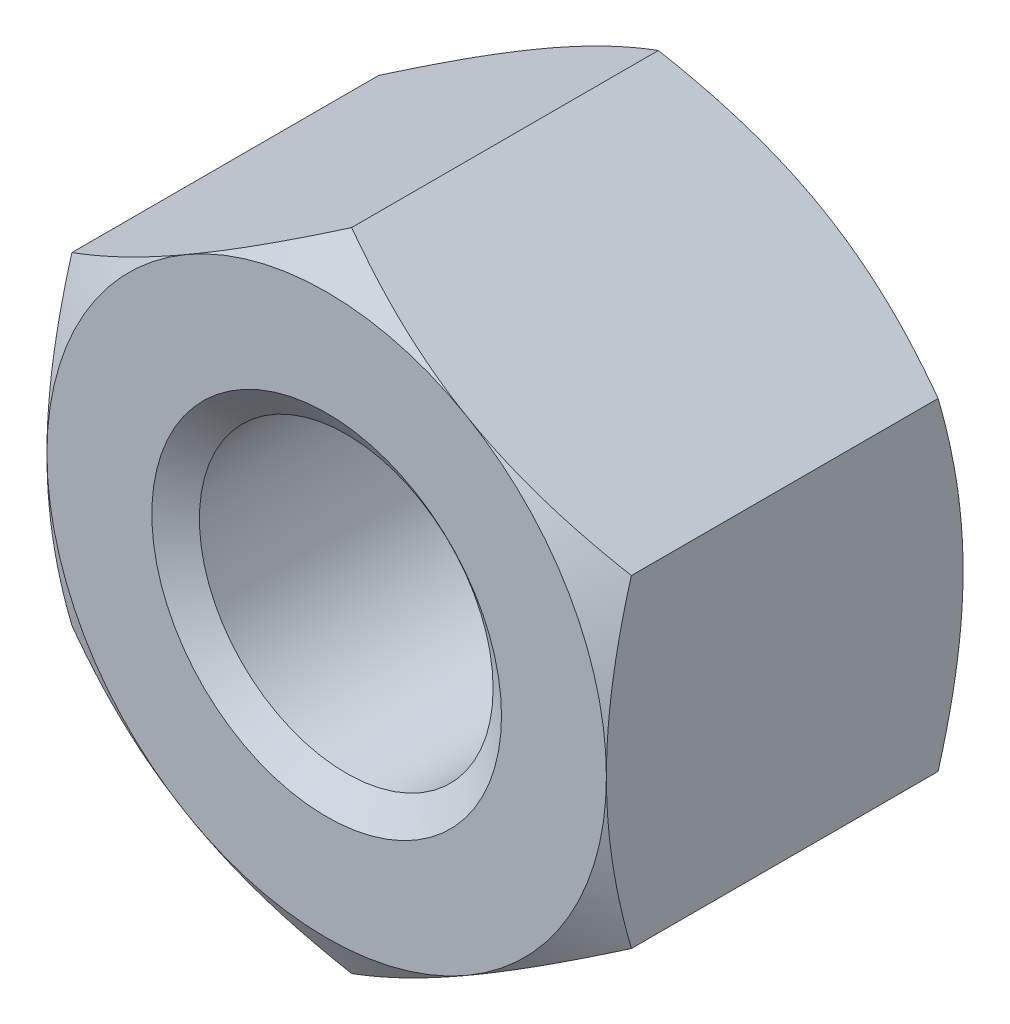
ISO-10303-21;
HEADER;
FILE_DESCRIPTION(('STEP AP214'),'2;1');
FILE_NAME('part.step','',(''),(''),'','','');
FILE_SCHEMA(('AUTOMOTIVE_DESIGN { 1 0 10303 214 1 1 1 1 }'));
ENDSEC;
DATA;
#1=APPLICATION_CONTEXT('core data for automotive mechanical design processes');
#2=APPLICATION_PROTOCOL_DEFINITION('international standard','automotive_design',2000,#1);
#3=PRODUCT_CONTEXT('',#1,'mechanical');
#4=PRODUCT('Part','Part','',(#3));
#5=PRODUCT_RELATED_PRODUCT_CATEGORY('part','',(#4));
#6=PRODUCT_DEFINITION_FORMATION('','',#4);
#7=PRODUCT_DEFINITION_CONTEXT('part definition',#1,'design');
#8=PRODUCT_DEFINITION('design','',#6,#7);
#9=PRODUCT_DEFINITION_SHAPE('','',#8);
#10=(LENGTH_UNIT() NAMED_UNIT(*) SI_UNIT(.MILLI.,.METRE.));
#11=(NAMED_UNIT(*) PLANE_ANGLE_UNIT() SI_UNIT($,.RADIAN.));
#12=(NAMED_UNIT(*) SI_UNIT($,.STERADIAN.) SOLID_ANGLE_UNIT());
#13=UNCERTAINTY_MEASURE_WITH_UNIT(LENGTH_MEASURE(1.E-05),#10,'distance_accuracy_value','');
#14=(GEOMETRIC_REPRESENTATION_CONTEXT(3) GLOBAL_UNCERTAINTY_ASSIGNED_CONTEXT((#13)) GLOBAL_UNIT_ASSIGNED_CONTEXT((#10,
#11,#12)) REPRESENTATION_CONTEXT('',''));
#15=CARTESIAN_POINT('',(0.,0.,0.));
#16=DIRECTION('',(0.,0.,1.));
#17=DIRECTION('',(1.,0.,0.));
#18=AXIS2_PLACEMENT_3D('',#15,#16,#17);
#19=CARTESIAN_POINT('',(0.,0.,-5.1));
#20=DIRECTION('',(0.,0.,1.));
#21=DIRECTION('',(1.,0.,0.));
#22=AXIS2_PLACEMENT_3D('',#19,#20,#21);
#23=CYLINDRICAL_SURFACE('',#22,2.1);
#24=CARTESIAN_POINT('',(0.,0.,-0.28008301528388));
#25=DIRECTION('',(0.,0.,1.));
#26=DIRECTION('',(1.,0.,0.));
#27=AXIS2_PLACEMENT_3D('',#24,#25,#26);
#28=CIRCLE('',#27,2.1);
#29=CARTESIAN_POINT('',(2.1,0.,-0.28008301528388));
#30=VERTEX_POINT('',#29);
#31=EDGE_CURVE('E175',#30,#30,#28,.F.);
#32=ORIENTED_EDGE('',*,*,#31,.F.);
#33=EDGE_LOOP('',(#32));
#34=FACE_BOUND('',#33,.T.);
#35=CARTESIAN_POINT('',(0.,0.,-4.79451698471611));
#36=DIRECTION('',(0.,0.,-1.));
#37=DIRECTION('',(-1.,0.,0.));
#38=AXIS2_PLACEMENT_3D('',#35,#36,#37);
#39=CIRCLE('',#38,2.1);
#40=CARTESIAN_POINT('',(-2.1,0.,-4.79451698471611));
#41=VERTEX_POINT('',#40);
#42=EDGE_CURVE('E40',#41,#41,#39,.F.);
#43=ORIENTED_EDGE('',*,*,#42,.F.);
#44=EDGE_LOOP('',(#43));
#45=FACE_BOUND('',#44,.T.);
#46=ADVANCED_FACE('F35',(#34,#45),#23,.F.);
#47=CARTESIAN_POINT('',(0.,4.61880215351702,-5.1));
#48=DIRECTION('',(0.,0.,-1.));
#49=DIRECTION('',(-1.,0.,0.));
#50=AXIS2_PLACEMENT_3D('',#47,#48,#49);
#51=PLANE('',#50);
#52=CARTESIAN_POINT('',(0.,0.,-5.1));
#53=DIRECTION('',(0.,0.,-1.));
#54=DIRECTION('',(-1.,0.,0.));
#55=AXIS2_PLACEMENT_3D('',#52,#53,#54);
#56=CIRCLE('',#55,4.);
#57=CARTESIAN_POINT('',(-4.,0.,-5.1));
#58=VERTEX_POINT('',#57);
#59=CARTESIAN_POINT('',(-2.00000000000002,-3.46410161513774,-5.1));
#60=VERTEX_POINT('',#59);
#61=EDGE_CURVE('E171',#58,#60,#56,.F.);
#62=ORIENTED_EDGE('',*,*,#61,.F.);
#63=CARTESIAN_POINT('',(-2.00000000000001,3.46410161513775,-5.1));
#64=VERTEX_POINT('',#63);
#65=EDGE_CURVE('E153',#64,#58,#56,.F.);
#66=ORIENTED_EDGE('',*,*,#65,.F.);
#67=CARTESIAN_POINT('',(2.00000000000003,3.46410161513774,-5.1));
#68=VERTEX_POINT('',#67);
#69=EDGE_CURVE('E170',#68,#64,#56,.F.);
#70=ORIENTED_EDGE('',*,*,#69,.F.);
#71=CARTESIAN_POINT('',(0.,0.,-5.1));
#72=DIRECTION('',(0.,0.,1.));
#73=DIRECTION('',(1.,0.,0.));
#74=AXIS2_PLACEMENT_3D('',#71,#72,#73);
#75=CIRCLE('',#74,4.);
#76=CARTESIAN_POINT('',(4.,0.,-5.1));
#77=VERTEX_POINT('',#76);
#78=EDGE_CURVE('E245',#77,#68,#75,.T.);
#79=ORIENTED_EDGE('',*,*,#78,.F.);
#80=CARTESIAN_POINT('',(2.00000000000001,-3.46410161513775,-5.1));
#81=VERTEX_POINT('',#80);
#82=EDGE_CURVE('E361',#81,#77,#56,.F.);
#83=ORIENTED_EDGE('',*,*,#82,.F.);
#84=EDGE_CURVE('E365',#60,#81,#56,.F.);
#85=ORIENTED_EDGE('',*,*,#84,.F.);
#86=EDGE_LOOP('',(#62,#66,#70,#79,#83,#85));
#87=FACE_BOUND('',#86,.T.);
#88=CARTESIAN_POINT('',(0.,0.,-5.1));
#89=DIRECTION('',(0.,0.,-1.));
#90=DIRECTION('',(-1.,0.,0.));
#91=AXIS2_PLACEMENT_3D('',#88,#89,#90);
#92=CIRCLE('',#91,2.5);
#93=CARTESIAN_POINT('',(-2.5,0.,-5.1));
#94=VERTEX_POINT('',#93);
#95=EDGE_CURVE('E178',#94,#94,#92,.F.);
#96=ORIENTED_EDGE('',*,*,#95,.T.);
#97=EDGE_LOOP('',(#96));
#98=FACE_BOUND('',#97,.T.);
#99=ADVANCED_FACE('F298',(#87,#98),#51,.T.);
#100=CARTESIAN_POINT('',(0.,4.61880215351702,0.));
#101=DIRECTION('',(0.,0.,-1.));
#102=DIRECTION('',(-1.,0.,0.));
#103=AXIS2_PLACEMENT_3D('',#100,#101,#102);
#104=PLANE('',#103);
#105=CARTESIAN_POINT('',(0.,0.,0.));
#106=DIRECTION('',(0.,0.,-1.));
#107=DIRECTION('',(-1.,0.,0.));
#108=AXIS2_PLACEMENT_3D('',#105,#106,#107);
#109=CIRCLE('',#108,4.);
#110=CARTESIAN_POINT('',(-4.,0.,0.));
#111=VERTEX_POINT('',#110);
#112=CARTESIAN_POINT('',(-2.00000000000001,3.46410161513775,0.));
#113=VERTEX_POINT('',#112);
#114=EDGE_CURVE('E11',#111,#113,#109,.T.);
#115=ORIENTED_EDGE('',*,*,#114,.F.);
#116=CARTESIAN_POINT('',(-2.00000000000002,-3.46410161513774,0.));
#117=VERTEX_POINT('',#116);
#118=EDGE_CURVE('E47',#117,#111,#109,.T.);
#119=ORIENTED_EDGE('',*,*,#118,.F.);
#120=CARTESIAN_POINT('',(2.00000000000001,-3.46410161513775,0.));
#121=VERTEX_POINT('',#120);
#122=EDGE_CURVE('E174',#121,#117,#109,.T.);
#123=ORIENTED_EDGE('',*,*,#122,.F.);
#124=CARTESIAN_POINT('',(4.,0.,0.));
#125=VERTEX_POINT('',#124);
#126=EDGE_CURVE('E352',#125,#121,#109,.T.);
#127=ORIENTED_EDGE('',*,*,#126,.F.);
#128=CARTESIAN_POINT('',(0.,0.,0.));
#129=DIRECTION('',(0.,0.,1.));
#130=DIRECTION('',(1.,0.,0.));
#131=AXIS2_PLACEMENT_3D('',#128,#129,#130);
#132=CIRCLE('',#131,4.);
#133=CARTESIAN_POINT('',(2.00000000000003,3.46410161513774,0.));
#134=VERTEX_POINT('',#133);
#135=EDGE_CURVE('E129',#125,#134,#132,.T.);
#136=ORIENTED_EDGE('',*,*,#135,.T.);
#137=EDGE_CURVE('E45',#113,#134,#109,.T.);
#138=ORIENTED_EDGE('',*,*,#137,.F.);
#139=EDGE_LOOP('',(#115,#119,#123,#127,#136,#138));
#140=FACE_BOUND('',#139,.T.);
#141=CARTESIAN_POINT('',(0.,0.,0.));
#142=DIRECTION('',(0.,0.,1.));
#143=DIRECTION('',(1.,0.,0.));
#144=AXIS2_PLACEMENT_3D('',#141,#142,#143);
#145=CIRCLE('',#144,2.5);
#146=CARTESIAN_POINT('',(2.5,0.,0.));
#147=VERTEX_POINT('',#146);
#148=EDGE_CURVE('E177',#147,#147,#145,.T.);
#149=ORIENTED_EDGE('',*,*,#148,.F.);
#150=EDGE_LOOP('',(#149));
#151=FACE_BOUND('',#150,.T.);
#152=ADVANCED_FACE('F250',(#140,#151),#104,.F.);
#153=CARTESIAN_POINT('',(0.,4.61880215351702,-5.1));
#154=DIRECTION('',(-0.500000000000002,0.866025403784437,0.));
#155=DIRECTION('',(-0.866025403784437,-0.500000000000002,0.));
#156=AXIS2_PLACEMENT_3D('',#153,#154,#155);
#157=PLANE('',#156);
#158=DIRECTION('',(0.,0.,1.));
#159=VECTOR('',#158,1.);
#160=CARTESIAN_POINT('',(-4.,2.3094010767585,-5.1));
#161=LINE('',#160,#159);
#162=CARTESIAN_POINT('',(-4.,2.30940107675853,-4.74273441009183));
#163=VERTEX_POINT('',#162);
#164=CARTESIAN_POINT('',(-4.,2.3094010767585,-0.357265589908162));
#165=VERTEX_POINT('',#164);
#166=EDGE_CURVE('E165',#163,#165,#161,.T.);
#167=ORIENTED_EDGE('',*,*,#166,.T.);
#168=CARTESIAN_POINT('',(-4.0002,2.30928560670466,-0.357332259074766));
#169=CARTESIAN_POINT('',(-3.82442084967677,2.4107717464617,-0.298717873648281));
#170=CARTESIAN_POINT('',(-3.64712438367362,2.51313390883499,-0.245410321462261));
#171=CARTESIAN_POINT('',(-3.28946140682429,2.71963072479811,-0.152361670746402));
#172=CARTESIAN_POINT('',(-3.10908854102985,2.82376904741904,-0.112653489029702));
#173=CARTESIAN_POINT('',(-2.75057818129721,3.03075510011795,-0.0508422152802773));
#174=CARTESIAN_POINT('',(-2.57249584706486,3.13357098372491,-0.028327731522887));
#175=CARTESIAN_POINT('',(-2.21549328283349,3.33968651028528,-0.00145062314658006));
#176=CARTESIAN_POINT('',(-2.0365743503559,3.44298540411434,0.00293425857305829));
#177=CARTESIAN_POINT('',(-1.70225715780327,3.63600352522932,-0.00619007293996944));
#178=CARTESIAN_POINT('',(-1.54680884001293,3.72575165335065,-0.017458953987994));
#179=CARTESIAN_POINT('',(-1.23692494436494,3.90466320392055,-0.0531739907981941));
#180=CARTESIAN_POINT('',(-1.08249043825587,3.99382600759479,-0.0776323457115346));
#181=CARTESIAN_POINT('',(-0.771967672225416,4.17310641015198,-0.138776064919293));
#182=CARTESIAN_POINT('',(-0.615918711936891,4.26320131938132,-0.175720603654868));
#183=CARTESIAN_POINT('',(-0.306148164596151,4.44204742827552,-0.259570072548033));
#184=CARTESIAN_POINT('',(-0.15242260922621,4.53080091904968,-0.306455302212748));
#185=CARTESIAN_POINT('',(0.000200000000011592,4.61891762357086,-0.357332259074776));
#186=B_SPLINE_CURVE_WITH_KNOTS('',3,(#168,#169,#170,#171,#172,#173,#174,#175,#176,#177,#178,
#179,#180,#181,#182,#183,#184,#185),.UNSPECIFIED.,.F.,.F.,(4,2,2,2,2,2,2,2,4),(0.,
0.634047835695967,1.26961969224543,1.88946157213122,2.50854226669297,3.04757825393386,
3.58711366126904,4.13861653143765,4.68903648037745),.UNSPECIFIED.);
#187=EDGE_CURVE('E134',#165,#113,#186,.T.);
#188=ORIENTED_EDGE('',*,*,#187,.T.);
#189=CARTESIAN_POINT('',(0.,4.61880215351702,-0.357265589908172));
#190=VERTEX_POINT('',#189);
#191=EDGE_CURVE('E54',#113,#190,#186,.T.);
#192=ORIENTED_EDGE('',*,*,#191,.T.);
#193=DIRECTION('',(0.,0.,1.));
#194=VECTOR('',#193,1.);
#195=CARTESIAN_POINT('',(0.,4.61880215351702,-5.1));
#196=LINE('',#195,#194);
#197=CARTESIAN_POINT('',(0.,4.61880215351702,-4.74273441009183));
#198=VERTEX_POINT('',#197);
#199=EDGE_CURVE('E150',#198,#190,#196,.T.);
#200=ORIENTED_EDGE('',*,*,#199,.F.);
#201=CARTESIAN_POINT('',(-4.0002,2.30928560670466,-4.74266774092523));
#202=CARTESIAN_POINT('',(-3.82442084967677,2.4107717464617,-4.80128212635172));
#203=CARTESIAN_POINT('',(-3.64712438367362,2.51313390883499,-4.85458967853774));
#204=CARTESIAN_POINT('',(-3.28946140682429,2.71963072479811,-4.9476383292536));
#205=CARTESIAN_POINT('',(-3.10908854102985,2.82376904741904,-4.9873465109703));
#206=CARTESIAN_POINT('',(-2.75057818129721,3.03075510011795,-5.04915778471972));
#207=CARTESIAN_POINT('',(-2.57249584706486,3.13357098372491,-5.07167226847711));
#208=CARTESIAN_POINT('',(-2.21549328283349,3.33968651028528,-5.09854937685342));
#209=CARTESIAN_POINT('',(-2.0365743503559,3.44298540411434,-5.10293425857306));
#210=CARTESIAN_POINT('',(-1.70225715780327,3.63600352522932,-5.09380992706003));
#211=CARTESIAN_POINT('',(-1.54680884001293,3.72575165335065,-5.082541046012));
#212=CARTESIAN_POINT('',(-1.23692494436494,3.90466320392055,-5.0468260092018));
#213=CARTESIAN_POINT('',(-1.08249043825587,3.99382600759479,-5.02236765428846));
#214=CARTESIAN_POINT('',(-0.771967672225416,4.17310641015198,-4.96122393508071));
#215=CARTESIAN_POINT('',(-0.61591871193689,4.26320131938132,-4.92427939634513));
#216=CARTESIAN_POINT('',(-0.306148164596151,4.44204742827552,-4.84042992745197));
#217=CARTESIAN_POINT('',(-0.15242260922621,4.53080091904968,-4.79354469778725));
#218=CARTESIAN_POINT('',(0.000200000000011907,4.61891762357086,-4.74266774092522));
#219=B_SPLINE_CURVE_WITH_KNOTS('',3,(#201,#202,#203,#204,#205,#206,#207,#208,#209,#210,#211,
#212,#213,#214,#215,#216,#217,#218),.UNSPECIFIED.,.F.,.F.,(4,2,2,2,2,2,2,2,4),(0.,
0.634047835695967,1.26961969224544,1.88946157213122,2.50854226669297,3.04757825393386,
3.58711366126904,4.13861653143765,4.68903648037745),.UNSPECIFIED.);
#220=EDGE_CURVE('E168',#64,#198,#219,.T.);
#221=ORIENTED_EDGE('',*,*,#220,.F.);
#222=EDGE_CURVE('E260',#163,#64,#219,.T.);
#223=ORIENTED_EDGE('',*,*,#222,.F.);
#224=EDGE_LOOP('',(#167,#188,#192,#200,#221,#223));
#225=FACE_BOUND('',#224,.T.);
#226=ADVANCED_FACE('F37',(#225),#157,.T.);
#227=CARTESIAN_POINT('',(4.,2.30940107675848,-5.1));
#228=DIRECTION('',(0.500000000000007,0.866025403784435,0.));
#229=DIRECTION('',(-0.866025403784435,0.500000000000007,0.));
#230=AXIS2_PLACEMENT_3D('',#227,#228,#229);
#231=PLANE('',#230);
#232=ORIENTED_EDGE('',*,*,#199,.T.);
#233=CARTESIAN_POINT('',(-0.000199999999988659,4.61891762357086,-0.357332259074776));
#234=CARTESIAN_POINT('',(0.175579150323239,4.51743148381382,-0.298717873648291));
#235=CARTESIAN_POINT('',(0.352875616326392,4.41506932144053,-0.24541032146227));
#236=CARTESIAN_POINT('',(0.710538593175717,4.2085725054774,-0.152361670746408));
#237=CARTESIAN_POINT('',(0.890911458970162,4.10443418285647,-0.112653489029708));
#238=CARTESIAN_POINT('',(1.2494218187028,3.89744813015756,-0.050842215280281));
#239=CARTESIAN_POINT('',(1.42750415293515,3.79463224655059,-0.02832773152289));
#240=CARTESIAN_POINT('',(1.78450671716652,3.58851671999022,-0.00145062314658152));
#241=CARTESIAN_POINT('',(1.96342564964411,3.48521782616116,0.00293425857305787));
#242=CARTESIAN_POINT('',(2.29774284219674,3.29219970504618,-0.00619007293996798));
#243=CARTESIAN_POINT('',(2.45319115998707,3.20245157692485,-0.0174589539879915));
#244=CARTESIAN_POINT('',(2.76307505563506,3.02354002635495,-0.0531739907981898));
#245=CARTESIAN_POINT('',(2.91750956174414,2.93437722268071,-0.0776323457115296));
#246=CARTESIAN_POINT('',(3.22803232777458,2.75509682012352,-0.138776064919286));
#247=CARTESIAN_POINT('',(3.38408128806311,2.66500191089418,-0.175720603654859));
#248=CARTESIAN_POINT('',(3.69385183540384,2.48615580199999,-0.259570072548023));
#249=CARTESIAN_POINT('',(3.84757739077378,2.39740231122583,-0.306455302212736));
#250=CARTESIAN_POINT('',(4.0002,2.30928560670464,-0.357332259074763));
#251=B_SPLINE_CURVE_WITH_KNOTS('',3,(#233,#234,#235,#236,#237,#238,#239,#240,#241,#242,#243,
#244,#245,#246,#247,#248,#249,#250),.UNSPECIFIED.,.F.,.F.,(4,2,2,2,2,2,2,2,4),(0.,
0.634047835695969,1.26961969224544,1.88946157213123,2.50854226669298,3.04757825393387,
3.58711366126905,4.13861653143765,4.68903648037745),.UNSPECIFIED.);
#252=EDGE_CURVE('E144',#190,#134,#251,.T.);
#253=ORIENTED_EDGE('',*,*,#252,.T.);
#254=CARTESIAN_POINT('',(4.,2.30940107675852,-0.357265589908172));
#255=VERTEX_POINT('',#254);
#256=EDGE_CURVE('E61',#134,#255,#251,.T.);
#257=ORIENTED_EDGE('',*,*,#256,.T.);
#258=DIRECTION('',(0.,0.,1.));
#259=VECTOR('',#258,1.);
#260=CARTESIAN_POINT('',(4.,2.30940107675848,-5.1));
#261=LINE('',#260,#259);
#262=CARTESIAN_POINT('',(4.,2.30940107675852,-4.74273441009183));
#263=VERTEX_POINT('',#262);
#264=EDGE_CURVE('E143',#263,#255,#261,.T.);
#265=ORIENTED_EDGE('',*,*,#264,.F.);
#266=CARTESIAN_POINT('',(-0.00019999999998845,4.61891762357086,-4.74266774092522));
#267=CARTESIAN_POINT('',(0.175579150323239,4.51743148381382,-4.80128212635171));
#268=CARTESIAN_POINT('',(0.352875616326392,4.41506932144053,-4.85458967853773));
#269=CARTESIAN_POINT('',(0.710538593175717,4.2085725054774,-4.94763832925359));
#270=CARTESIAN_POINT('',(0.890911458970162,4.10443418285647,-4.98734651097029));
#271=CARTESIAN_POINT('',(1.2494218187028,3.89744813015756,-5.04915778471972));
#272=CARTESIAN_POINT('',(1.42750415293515,3.79463224655059,-5.07167226847711));
#273=CARTESIAN_POINT('',(1.78450671716652,3.58851671999022,-5.09854937685342));
#274=CARTESIAN_POINT('',(1.96342564964411,3.48521782616116,-5.10293425857306));
#275=CARTESIAN_POINT('',(2.29774284219674,3.29219970504618,-5.09380992706003));
#276=CARTESIAN_POINT('',(2.45319115998708,3.20245157692485,-5.08254104601201));
#277=CARTESIAN_POINT('',(2.76307505563506,3.02354002635495,-5.04682600920181));
#278=CARTESIAN_POINT('',(2.91750956174414,2.93437722268071,-5.02236765428847));
#279=CARTESIAN_POINT('',(3.22803232777459,2.75509682012352,-4.96122393508071));
#280=CARTESIAN_POINT('',(3.38408128806311,2.66500191089418,-4.92427939634514));
#281=CARTESIAN_POINT('',(3.69385183540384,2.48615580199999,-4.84042992745198));
#282=CARTESIAN_POINT('',(3.84757739077378,2.39740231122583,-4.79354469778726));
#283=CARTESIAN_POINT('',(4.0002,2.30928560670464,-4.74266774092524));
#284=B_SPLINE_CURVE_WITH_KNOTS('',3,(#266,#267,#268,#269,#270,#271,#272,#273,#274,#275,#276,
#277,#278,#279,#280,#281,#282,#283),.UNSPECIFIED.,.F.,.F.,(4,2,2,2,2,2,2,2,4),(0.,
0.634047835695968,1.26961969224544,1.88946157213123,2.50854226669298,3.04757825393387,
3.58711366126905,4.13861653143765,4.68903648037745),.UNSPECIFIED.);
#285=EDGE_CURVE('E254',#68,#263,#284,.T.);
#286=ORIENTED_EDGE('',*,*,#285,.F.);
#287=EDGE_CURVE('E259',#198,#68,#284,.T.);
#288=ORIENTED_EDGE('',*,*,#287,.F.);
#289=EDGE_LOOP('',(#232,#253,#257,#265,#286,#288));
#290=FACE_BOUND('',#289,.T.);
#291=ADVANCED_FACE('F141',(#290),#231,.T.);
#292=CARTESIAN_POINT('',(4.,2.30940107675848,-5.1));
#293=DIRECTION('',(-1.,0.,0.));
#294=DIRECTION('',(0.,0.,1.));
#295=AXIS2_PLACEMENT_3D('',#292,#293,#294);
#296=PLANE('',#295);
#297=CARTESIAN_POINT('',(4.,-6.12487198995896,-1.91410682124066));
#298=CARTESIAN_POINT('',(4.,-5.9492493703868,-1.82923627076692));
#299=CARTESIAN_POINT('',(4.,-5.7732115209529,-1.74520940380742));
#300=CARTESIAN_POINT('',(4.,-5.42008084777958,-1.57932514679718));
#301=CARTESIAN_POINT('',(4.,-5.24298784779932,-1.49746813236725));
#302=CARTESIAN_POINT('',(4.,-4.88656571686338,-1.33597446305858));
#303=CARTESIAN_POINT('',(4.,-4.70722958889366,-1.25635319506306));
#304=CARTESIAN_POINT('',(4.,-4.34708334747267,-1.10053058542031));
#305=CARTESIAN_POINT('',(4.,-4.16627331143541,-1.02432906550804));
#306=CARTESIAN_POINT('',(4.,-3.80064706744981,-0.875350650394378));
#307=CARTESIAN_POINT('',(4.,-3.61580892822773,-0.80262728421586));
#308=CARTESIAN_POINT('',(4.,-3.24395246794972,-0.662876230959434));
#309=CARTESIAN_POINT('',(4.,-3.05693390695805,-0.595849177566518));
#310=CARTESIAN_POINT('',(4.,-2.68080318253774,-0.469291748430894));
#311=CARTESIAN_POINT('',(4.,-2.49169643712852,-0.409745434783849));
#312=CARTESIAN_POINT('',(4.,-2.11079454635854,-0.300083356544516));
#313=CARTESIAN_POINT('',(4.,-1.91900027185752,-0.249964609676761));
#314=CARTESIAN_POINT('',(4.,-1.53259232698203,-0.161590794954049));
#315=CARTESIAN_POINT('',(4.,-1.33797792031653,-0.123338885956547));
#316=CARTESIAN_POINT('',(4.,-0.946402725872582,-0.0612742359223484));
#317=CARTESIAN_POINT('',(4.,-0.749441936019801,-0.0374615076517028));
#318=CARTESIAN_POINT('',(4.,-0.355451989627968,-0.0063818131494385));
#319=CARTESIAN_POINT('',(4.,-0.158431311094037,0.000989900761039599));
#320=CARTESIAN_POINT('',(4.,0.235472085607445,-0.0012040663747964));
#321=CARTESIAN_POINT('',(4.,0.432354826312182,-0.010765350815351));
#322=CARTESIAN_POINT('',(4.,0.768560635225495,-0.04087873461359));
#323=CARTESIAN_POINT('',(4.,0.908254618381797,-0.0575092960439085));
#324=CARTESIAN_POINT('',(4.,1.18656349063495,-0.0982134103466896));
#325=CARTESIAN_POINT('',(4.,1.32517820601011,-0.122288137058444));
#326=CARTESIAN_POINT('',(4.,1.73929045452967,-0.204415070950227));
#327=CARTESIAN_POINT('',(4.,2.0128469052872,-0.272348886425148));
#328=CARTESIAN_POINT('',(4.,2.42218253014521,-0.389516359317197));
#329=CARTESIAN_POINT('',(4.,2.56009536361536,-0.43171394181163));
#330=CARTESIAN_POINT('',(4.,2.83448159101401,-0.520284580227755));
#331=CARTESIAN_POINT('',(4.,2.97095590623555,-0.566654756186905));
#332=CARTESIAN_POINT('',(4.,3.24189440516338,-0.662605699180278));
#333=CARTESIAN_POINT('',(4.,3.37636557946835,-0.712166925753491));
#334=CARTESIAN_POINT('',(4.,3.64426461152911,-0.814198353790692));
#335=CARTESIAN_POINT('',(4.,3.77769202239384,-0.866669730963359));
#336=CARTESIAN_POINT('',(4.,3.91063698986681,-0.920309006541782));
#337=B_SPLINE_CURVE_WITH_KNOTS('',3,(#297,#298,#299,#300,#301,#302,#303,#304,#305,#306,#307,
#308,#309,#310,#311,#312,#313,#314,#315,#316,#317,#318,#319,#320,#321,#322,#323,#324,#325,#326,
#327,#328,#329,#330,#331,#332,#333,#334,#335,#336),.UNSPECIFIED.,.F.,.F.,(4,2,2,2,2,2,2,2,2,2,2,
2,2,2,2,2,2,2,2,4),(0.,0.585171792532273,1.17044423059927,1.7590659464599,2.34765694284828,
2.94347400997484,3.5393572721069,4.13394864697602,4.72835161391473,5.32291267067847,
5.91747425310815,6.50823685854039,7.09884609659889,7.52068140825524,7.94258327130842,
8.78701491359832,9.21965281897691,9.65199437116299,10.0819024146297,10.5119854255247),.UNSPECIFIED.);
#338=CARTESIAN_POINT('',(3.99999999999999,-2.30940107675855,-0.357265589908172));
#339=VERTEX_POINT('',#338);
#340=EDGE_CURVE('E136',#339,#125,#337,.T.);
#341=ORIENTED_EDGE('',*,*,#340,.F.);
#342=DIRECTION('',(0.,0.,1.));
#343=VECTOR('',#342,1.);
#344=CARTESIAN_POINT('',(4.,-2.30940107675854,-5.1));
#345=LINE('',#344,#343);
#346=CARTESIAN_POINT('',(3.99999999999999,-2.30940107675855,-4.74273441009183));
#347=VERTEX_POINT('',#346);
#348=EDGE_CURVE('E151',#347,#339,#345,.T.);
#349=ORIENTED_EDGE('',*,*,#348,.F.);
#350=CARTESIAN_POINT('',(4.,-6.12487198995896,-3.18589317875933));
#351=CARTESIAN_POINT('',(4.,-5.9492493703868,-3.27076372923308));
#352=CARTESIAN_POINT('',(4.,-5.7732115209529,-3.35479059619258));
#353=CARTESIAN_POINT('',(4.,-5.42008084777958,-3.52067485320281));
#354=CARTESIAN_POINT('',(4.,-5.24298784779931,-3.60253186763275));
#355=CARTESIAN_POINT('',(4.,-4.88656571686338,-3.76402553694142));
#356=CARTESIAN_POINT('',(4.,-4.70722958889366,-3.84364680493694));
#357=CARTESIAN_POINT('',(4.,-4.34708334747267,-3.99946941457968));
#358=CARTESIAN_POINT('',(4.,-4.16627331143541,-4.07567093449196));
#359=CARTESIAN_POINT('',(4.,-3.80064706744981,-4.22464934960562));
#360=CARTESIAN_POINT('',(4.,-3.61580892822773,-4.29737271578414));
#361=CARTESIAN_POINT('',(4.,-3.24395246794972,-4.43712376904056));
#362=CARTESIAN_POINT('',(4.,-3.05693390695804,-4.50415082243348));
#363=CARTESIAN_POINT('',(4.,-2.68080318253774,-4.6307082515691));
#364=CARTESIAN_POINT('',(4.,-2.49169643712852,-4.69025456521615));
#365=CARTESIAN_POINT('',(4.,-2.11079454635854,-4.79991664345548));
#366=CARTESIAN_POINT('',(4.,-1.91900027185752,-4.85003539032324));
#367=CARTESIAN_POINT('',(4.,-1.53259232698203,-4.93840920504595));
#368=CARTESIAN_POINT('',(4.,-1.33797792031653,-4.97666111404345));
#369=CARTESIAN_POINT('',(4.,-0.946402725872582,-5.03872576407765));
#370=CARTESIAN_POINT('',(4.,-0.749441936019801,-5.0625384923483));
#371=CARTESIAN_POINT('',(4.,-0.355451989627969,-5.09361818685056));
#372=CARTESIAN_POINT('',(4.,-0.158431311094036,-5.10098990076104));
#373=CARTESIAN_POINT('',(4.,0.235472085607445,-5.0987959336252));
#374=CARTESIAN_POINT('',(4.,0.432354826312183,-5.08923464918465));
#375=CARTESIAN_POINT('',(4.,0.768560635225495,-5.05912126538641));
#376=CARTESIAN_POINT('',(4.,0.908254618381797,-5.04249070395609));
#377=CARTESIAN_POINT('',(4.,1.18656349063495,-5.00178658965331));
#378=CARTESIAN_POINT('',(4.,1.32517820601011,-4.97771186294156));
#379=CARTESIAN_POINT('',(4.,1.73929045452967,-4.89558492904977));
#380=CARTESIAN_POINT('',(4.,2.01284690528719,-4.82765111357485));
#381=CARTESIAN_POINT('',(4.,2.42218253014521,-4.7104836406828));
#382=CARTESIAN_POINT('',(4.,2.56009536361535,-4.66828605818837));
#383=CARTESIAN_POINT('',(4.,2.83448159101401,-4.57971541977225));
#384=CARTESIAN_POINT('',(4.,2.97095590623554,-4.5333452438131));
#385=CARTESIAN_POINT('',(4.,3.24189440516337,-4.43739430081972));
#386=CARTESIAN_POINT('',(4.,3.37636557946834,-4.38783307424651));
#387=CARTESIAN_POINT('',(4.,3.6442646115291,-4.28580164620931));
#388=CARTESIAN_POINT('',(4.,3.77769202239383,-4.23333026903664));
#389=CARTESIAN_POINT('',(4.,3.9106369898668,-4.17969099345822));
#390=B_SPLINE_CURVE_WITH_KNOTS('',3,(#350,#351,#352,#353,#354,#355,#356,#357,#358,#359,#360,
#361,#362,#363,#364,#365,#366,#367,#368,#369,#370,#371,#372,#373,#374,#375,#376,#377,#378,#379,
#380,#381,#382,#383,#384,#385,#386,#387,#388,#389),.UNSPECIFIED.,.F.,.F.,(4,2,2,2,2,2,2,2,2,2,2,
2,2,2,2,2,2,2,2,4),(0.,0.585171792532274,1.17044423059927,1.7590659464599,2.34765694284828,
2.94347400997484,3.5393572721069,4.13394864697602,4.72835161391473,5.32291267067847,
5.91747425310815,6.50823685854039,7.09884609659889,7.52068140825524,7.94258327130842,
8.78701491359831,9.21965281897691,9.65199437116298,10.0819024146297,10.5119854255247),.UNSPECIFIED.);
#391=EDGE_CURVE('E266',#347,#77,#390,.T.);
#392=ORIENTED_EDGE('',*,*,#391,.T.);
#393=EDGE_CURVE('E149',#77,#263,#390,.T.);
#394=ORIENTED_EDGE('',*,*,#393,.T.);
#395=ORIENTED_EDGE('',*,*,#264,.T.);
#396=EDGE_CURVE('E126',#125,#255,#337,.T.);
#397=ORIENTED_EDGE('',*,*,#396,.F.);
#398=EDGE_LOOP('',(#341,#349,#392,#394,#395,#397));
#399=FACE_BOUND('',#398,.T.);
#400=ADVANCED_FACE('F147',(#399),#296,.F.);
#401=CARTESIAN_POINT('',(0.,-4.61880215351706,-5.1));
#402=DIRECTION('',(0.500000000000003,-0.866025403784437,0.));
#403=DIRECTION('',(0.866025403784437,0.500000000000003,0.));
#404=AXIS2_PLACEMENT_3D('',#401,#402,#403);
#405=PLANE('',#404);
#406=ORIENTED_EDGE('',*,*,#348,.T.);
#407=CARTESIAN_POINT('',(4.0002,-2.3092856067047,-0.35733225907478));
#408=CARTESIAN_POINT('',(3.82442084967677,-2.41077174646174,-0.298717873648296));
#409=CARTESIAN_POINT('',(3.64712438367362,-2.51313390883503,-0.245410321462276));
#410=CARTESIAN_POINT('',(3.28946140682429,-2.71963072479816,-0.152361670746418));
#411=CARTESIAN_POINT('',(3.10908854102985,-2.82376904741908,-0.11265348902972));
#412=CARTESIAN_POINT('',(2.75057818129721,-3.03075510011799,-0.0508422152802962));
#413=CARTESIAN_POINT('',(2.57249584706485,-3.13357098372496,-0.028327731522907));
#414=CARTESIAN_POINT('',(2.21549328283349,-3.33968651028533,-0.00145062314660208));
#415=CARTESIAN_POINT('',(2.03657435035589,-3.44298540411439,0.00293425857303551));
#416=CARTESIAN_POINT('',(1.70225715780326,-3.63600352522937,-0.00619007293999381));
#417=CARTESIAN_POINT('',(1.54680884001293,-3.7257516533507,-0.0174589539880189));
#418=CARTESIAN_POINT('',(1.23692494436494,-3.90466320392059,-0.0531739907982198));
#419=CARTESIAN_POINT('',(1.08249043825586,-3.99382600759484,-0.0776323457115605));
#420=CARTESIAN_POINT('',(0.771967672225417,-4.17310641015202,-0.138776064919318));
#421=CARTESIAN_POINT('',(0.615918711936894,-4.26320131938137,-0.175720603654893));
#422=CARTESIAN_POINT('',(0.306148164596158,-4.44204742827556,-0.259570072548059));
#423=CARTESIAN_POINT('',(0.152422609226218,-4.53080091904972,-0.306455302212772));
#424=CARTESIAN_POINT('',(-0.000200000000002338,-4.6189176235709,-0.3573322590748));
#425=B_SPLINE_CURVE_WITH_KNOTS('',3,(#407,#408,#409,#410,#411,#412,#413,#414,#415,#416,#417,
#418,#419,#420,#421,#422,#423,#424),.UNSPECIFIED.,.F.,.F.,(4,2,2,2,2,2,2,2,4),(0.,
0.63404783569597,1.26961969224544,1.88946157213123,2.50854226669298,3.04757825393387,
3.58711366126905,4.13861653143765,4.68903648037745),.UNSPECIFIED.);
#426=EDGE_CURVE('E347',#339,#121,#425,.T.);
#427=ORIENTED_EDGE('',*,*,#426,.T.);
#428=CARTESIAN_POINT('',(0.,-4.61880215351702,-0.357265589908172));
#429=VERTEX_POINT('',#428);
#430=EDGE_CURVE('E226',#121,#429,#425,.T.);
#431=ORIENTED_EDGE('',*,*,#430,.T.);
#432=DIRECTION('',(0.,0.,1.));
#433=VECTOR('',#432,1.);
#434=CARTESIAN_POINT('',(0.,-4.61880215351706,-5.1));
#435=LINE('',#434,#433);
#436=CARTESIAN_POINT('',(0.,-4.61880215351702,-4.74273441009183));
#437=VERTEX_POINT('',#436);
#438=EDGE_CURVE('E156',#437,#429,#435,.T.);
#439=ORIENTED_EDGE('',*,*,#438,.F.);
#440=CARTESIAN_POINT('',(4.0002,-2.3092856067047,-4.74266774092522));
#441=CARTESIAN_POINT('',(3.82442084967678,-2.41077174646174,-4.8012821263517));
#442=CARTESIAN_POINT('',(3.64712438367362,-2.51313390883503,-4.85458967853772));
#443=CARTESIAN_POINT('',(3.28946140682429,-2.71963072479816,-4.94763832925358));
#444=CARTESIAN_POINT('',(3.10908854102985,-2.82376904741908,-4.98734651097028));
#445=CARTESIAN_POINT('',(2.75057818129721,-3.030755100118,-5.0491577847197));
#446=CARTESIAN_POINT('',(2.57249584706485,-3.13357098372496,-5.07167226847709));
#447=CARTESIAN_POINT('',(2.21549328283349,-3.33968651028533,-5.0985493768534));
#448=CARTESIAN_POINT('',(2.03657435035589,-3.44298540411439,-5.10293425857303));
#449=CARTESIAN_POINT('',(1.70225715780326,-3.63600352522937,-5.09380992706001));
#450=CARTESIAN_POINT('',(1.54680884001293,-3.7257516533507,-5.08254104601198));
#451=CARTESIAN_POINT('',(1.23692494436494,-3.9046632039206,-5.04682600920178));
#452=CARTESIAN_POINT('',(1.08249043825586,-3.99382600759484,-5.02236765428844));
#453=CARTESIAN_POINT('',(0.771967672225417,-4.17310641015202,-4.96122393508068));
#454=CARTESIAN_POINT('',(0.615918711936894,-4.26320131938136,-4.92427939634511));
#455=CARTESIAN_POINT('',(0.306148164596158,-4.44204742827556,-4.84042992745194));
#456=CARTESIAN_POINT('',(0.152422609226218,-4.53080091904972,-4.79354469778723));
#457=CARTESIAN_POINT('',(-0.000200000000001826,-4.6189176235709,-4.7426677409252));
#458=B_SPLINE_CURVE_WITH_KNOTS('',3,(#440,#441,#442,#443,#444,#445,#446,#447,#448,#449,#450,
#451,#452,#453,#454,#455,#456,#457),.UNSPECIFIED.,.F.,.F.,(4,2,2,2,2,2,2,2,4),(0.,
0.634047835695969,1.26961969224544,1.88946157213123,2.50854226669298,3.04757825393387,
3.58711366126905,4.13861653143765,4.68903648037745),.UNSPECIFIED.);
#459=EDGE_CURVE('E272',#81,#437,#458,.T.);
#460=ORIENTED_EDGE('',*,*,#459,.F.);
#461=EDGE_CURVE('E271',#347,#81,#458,.T.);
#462=ORIENTED_EDGE('',*,*,#461,.F.);
#463=EDGE_LOOP('',(#406,#427,#431,#439,#460,#462));
#464=FACE_BOUND('',#463,.T.);
#465=ADVANCED_FACE('F282',(#464),#405,.T.);
#466=CARTESIAN_POINT('',(-4.,-2.30940107675853,-5.1));
#467=DIRECTION('',(-0.500000000000006,-0.866025403784435,0.));
#468=DIRECTION('',(0.866025403784435,-0.500000000000006,0.));
#469=AXIS2_PLACEMENT_3D('',#466,#467,#468);
#470=PLANE('',#469);
#471=ORIENTED_EDGE('',*,*,#438,.T.);
#472=CARTESIAN_POINT('',(0.000199999999997729,-4.6189176235709,-0.3573322590748));
#473=CARTESIAN_POINT('',(-0.175579150323231,-4.51743148381386,-0.298717873648314));
#474=CARTESIAN_POINT('',(-0.352875616326386,-4.41506932144057,-0.245410321462293));
#475=CARTESIAN_POINT('',(-0.710538593175715,-4.20857250547744,-0.15236167074643));
#476=CARTESIAN_POINT('',(-0.890911458970161,-4.10443418285651,-0.11265348902973));
#477=CARTESIAN_POINT('',(-1.2494218187028,-3.8974481301576,-0.050842215280302));
#478=CARTESIAN_POINT('',(-1.42750415293516,-3.79463224655063,-0.0283277315229109));
#479=CARTESIAN_POINT('',(-1.78450671716653,-3.58851671999026,-0.00145062314660173));
#480=CARTESIAN_POINT('',(-1.96342564964412,-3.4852178261612,0.00293425857303805));
#481=CARTESIAN_POINT('',(-2.29774284219675,-3.29219970504621,-0.00619007293998753));
#482=CARTESIAN_POINT('',(-2.45319115998708,-3.20245157692489,-0.0174589539880108));
#483=CARTESIAN_POINT('',(-2.76307505563507,-3.02354002635499,-0.0531739907982082));
#484=CARTESIAN_POINT('',(-2.91750956174414,-2.93437722268075,-0.0776323457115473));
#485=CARTESIAN_POINT('',(-3.22803232777459,-2.75509682012356,-0.138776064919302));
#486=CARTESIAN_POINT('',(-3.38408128806311,-2.66500191089422,-0.175720603654875));
#487=CARTESIAN_POINT('',(-3.69385183540384,-2.48615580200003,-0.259570072548037));
#488=CARTESIAN_POINT('',(-3.84757739077378,-2.39740231122587,-0.306455302212749));
#489=CARTESIAN_POINT('',(-4.0002,-2.30928560670469,-0.357332259074774));
#490=B_SPLINE_CURVE_WITH_KNOTS('',3,(#472,#473,#474,#475,#476,#477,#478,#479,#480,#481,#482,
#483,#484,#485,#486,#487,#488,#489),.UNSPECIFIED.,.F.,.F.,(4,2,2,2,2,2,2,2,4),(0.,
0.634047835695975,1.26961969224545,1.88946157213125,2.508542266693,3.04757825393389,
3.58711366126906,4.13861653143766,4.68903648037745),.UNSPECIFIED.);
#491=EDGE_CURVE('E345',#429,#117,#490,.T.);
#492=ORIENTED_EDGE('',*,*,#491,.T.);
#493=CARTESIAN_POINT('',(-4.,-2.30940107675853,-0.357265589908172));
#494=VERTEX_POINT('',#493);
#495=EDGE_CURVE('E200',#117,#494,#490,.T.);
#496=ORIENTED_EDGE('',*,*,#495,.T.);
#497=DIRECTION('',(0.,0.,1.));
#498=VECTOR('',#497,1.);
#499=CARTESIAN_POINT('',(-4.,-2.30940107675853,-5.1));
#500=LINE('',#499,#498);
#501=CARTESIAN_POINT('',(-4.,-2.30940107675853,-4.74273441009183));
#502=VERTEX_POINT('',#501);
#503=EDGE_CURVE('E162',#502,#494,#500,.T.);
#504=ORIENTED_EDGE('',*,*,#503,.F.);
#505=CARTESIAN_POINT('',(0.000199999999997729,-4.6189176235709,-4.7426677409252));
#506=CARTESIAN_POINT('',(-0.175579150323231,-4.51743148381386,-4.80128212635169));
#507=CARTESIAN_POINT('',(-0.352875616326386,-4.41506932144057,-4.85458967853771));
#508=CARTESIAN_POINT('',(-0.710538593175714,-4.20857250547744,-4.94763832925357));
#509=CARTESIAN_POINT('',(-0.89091145897016,-4.10443418285651,-4.98734651097027));
#510=CARTESIAN_POINT('',(-1.2494218187028,-3.8974481301576,-5.0491577847197));
#511=CARTESIAN_POINT('',(-1.42750415293516,-3.79463224655063,-5.07167226847709));
#512=CARTESIAN_POINT('',(-1.78450671716653,-3.58851671999026,-5.0985493768534));
#513=CARTESIAN_POINT('',(-1.96342564964412,-3.4852178261612,-5.10293425857304));
#514=CARTESIAN_POINT('',(-2.29774284219675,-3.29219970504621,-5.09380992706001));
#515=CARTESIAN_POINT('',(-2.45319115998708,-3.20245157692489,-5.08254104601199));
#516=CARTESIAN_POINT('',(-2.76307505563507,-3.02354002635499,-5.04682600920179));
#517=CARTESIAN_POINT('',(-2.91750956174414,-2.93437722268075,-5.02236765428845));
#518=CARTESIAN_POINT('',(-3.22803232777459,-2.75509682012356,-4.9612239350807));
#519=CARTESIAN_POINT('',(-3.38408128806311,-2.66500191089422,-4.92427939634512));
#520=CARTESIAN_POINT('',(-3.69385183540384,-2.48615580200003,-4.84042992745196));
#521=CARTESIAN_POINT('',(-3.84757739077378,-2.39740231122587,-4.79354469778725));
#522=CARTESIAN_POINT('',(-4.0002,-2.30928560670469,-4.74266774092523));
#523=B_SPLINE_CURVE_WITH_KNOTS('',3,(#505,#506,#507,#508,#509,#510,#511,#512,#513,#514,#515,
#516,#517,#518,#519,#520,#521,#522),.UNSPECIFIED.,.F.,.F.,(4,2,2,2,2,2,2,2,4),(0.,
0.634047835695974,1.26961969224545,1.88946157213125,2.508542266693,3.04757825393389,
3.58711366126906,4.13861653143766,4.68903648037745),.UNSPECIFIED.);
#524=EDGE_CURVE('E278',#60,#502,#523,.T.);
#525=ORIENTED_EDGE('',*,*,#524,.F.);
#526=EDGE_CURVE('E277',#437,#60,#523,.T.);
#527=ORIENTED_EDGE('',*,*,#526,.F.);
#528=EDGE_LOOP('',(#471,#492,#496,#504,#525,#527));
#529=FACE_BOUND('',#528,.T.);
#530=ADVANCED_FACE('F285',(#529),#470,.T.);
#531=CARTESIAN_POINT('',(-4.,2.3094010767585,-5.1));
#532=DIRECTION('',(-1.,0.,0.));
#533=DIRECTION('',(0.,0.,1.));
#534=AXIS2_PLACEMENT_3D('',#531,#532,#533);
#535=PLANE('',#534);
#536=ORIENTED_EDGE('',*,*,#503,.T.);
#537=CARTESIAN_POINT('',(-4.,-6.12487198995894,-1.91410682124065));
#538=CARTESIAN_POINT('',(-4.,-5.94924937038678,-1.82923627076691));
#539=CARTESIAN_POINT('',(-4.,-5.77321152095288,-1.74520940380741));
#540=CARTESIAN_POINT('',(-4.,-5.42008084777957,-1.57932514679717));
#541=CARTESIAN_POINT('',(-4.,-5.2429878477993,-1.49746813236724));
#542=CARTESIAN_POINT('',(-4.,-4.88656571686336,-1.33597446305857));
#543=CARTESIAN_POINT('',(-4.,-4.70722958889364,-1.25635319506305));
#544=CARTESIAN_POINT('',(-4.,-4.34708334747265,-1.10053058542031));
#545=CARTESIAN_POINT('',(-4.,-4.16627331143539,-1.02432906550803));
#546=CARTESIAN_POINT('',(-4.,-3.80064706744979,-0.875350650394369));
#547=CARTESIAN_POINT('',(-4.,-3.61580892822772,-0.802627284215852));
#548=CARTESIAN_POINT('',(-4.,-3.2439524679497,-0.662876230959426));
#549=CARTESIAN_POINT('',(-4.,-3.05693390695803,-0.59584917756651));
#550=CARTESIAN_POINT('',(-4.,-2.68080318253772,-0.469291748430887));
#551=CARTESIAN_POINT('',(-4.,-2.4916964371285,-0.409745434783842));
#552=CARTESIAN_POINT('',(-4.,-2.11079454635853,-0.300083356544511));
#553=CARTESIAN_POINT('',(-4.,-1.9190002718575,-0.249964609676756));
#554=CARTESIAN_POINT('',(-4.,-1.53259232698202,-0.161590794954044));
#555=CARTESIAN_POINT('',(-4.,-1.33797792031651,-0.123338885956542));
#556=CARTESIAN_POINT('',(-4.,-0.94640272587257,-0.0612742359223449));
#557=CARTESIAN_POINT('',(-4.,-0.74944193601979,-0.0374615076516999));
#558=CARTESIAN_POINT('',(-4.,-0.355451989627958,-0.00638181314943633));
#559=CARTESIAN_POINT('',(-4.,-0.158431311094026,0.000989900761041733));
#560=CARTESIAN_POINT('',(-4.,0.235472085607454,-0.00120406637479453));
#561=CARTESIAN_POINT('',(-4.,0.432354826312191,-0.0107653508153494));
#562=CARTESIAN_POINT('',(-4.,0.768560635225503,-0.0408787346135886));
#563=CARTESIAN_POINT('',(-4.,0.908254618381805,-0.0575092960439073));
#564=CARTESIAN_POINT('',(-4.,1.18656349063496,-0.0982134103466887));
#565=CARTESIAN_POINT('',(-4.,1.32517820601012,-0.122288137058443));
#566=CARTESIAN_POINT('',(-4.,1.73929045452968,-0.204415070950227));
#567=CARTESIAN_POINT('',(-4.,2.0128469052872,-0.272348886425149));
#568=CARTESIAN_POINT('',(-4.,2.42218253014522,-0.389516359317198));
#569=CARTESIAN_POINT('',(-4.,2.56009536361537,-0.431713941811631));
#570=CARTESIAN_POINT('',(-4.,2.83448159101402,-0.520284580227757));
#571=CARTESIAN_POINT('',(-4.,2.97095590623556,-0.566654756186906));
#572=CARTESIAN_POINT('',(-4.,3.24189440516339,-0.66260569918028));
#573=CARTESIAN_POINT('',(-4.,3.37636557946836,-0.712166925753494));
#574=CARTESIAN_POINT('',(-4.,3.64426461152912,-0.814198353790695));
#575=CARTESIAN_POINT('',(-4.,3.77769202239385,-0.866669730963362));
#576=CARTESIAN_POINT('',(-4.,3.91063698986682,-0.920309006541785));
#577=B_SPLINE_CURVE_WITH_KNOTS('',3,(#537,#538,#539,#540,#541,#542,#543,#544,#545,#546,#547,
#548,#549,#550,#551,#552,#553,#554,#555,#556,#557,#558,#559,#560,#561,#562,#563,#564,#565,#566,
#567,#568,#569,#570,#571,#572,#573,#574,#575,#576),.UNSPECIFIED.,.F.,.F.,(4,2,2,2,2,2,2,2,2,2,2,
2,2,2,2,2,2,2,2,4),(0.,0.585171792532271,1.17044423059927,1.7590659464599,2.34765694284827,
2.94347400997484,3.5393572721069,4.13394864697601,4.72835161391472,5.32291267067846,
5.91747425310814,6.50823685854038,7.09884609659888,7.52068140825522,7.9425832713084,
8.7870149135983,9.2196528189769,9.65199437116298,10.0819024146297,10.5119854255247),.UNSPECIFIED.);
#578=EDGE_CURVE('E199',#494,#111,#577,.T.);
#579=ORIENTED_EDGE('',*,*,#578,.T.);
#580=EDGE_CURVE('E192',#111,#165,#577,.T.);
#581=ORIENTED_EDGE('',*,*,#580,.T.);
#582=ORIENTED_EDGE('',*,*,#166,.F.);
#583=CARTESIAN_POINT('',(-4.,-6.12487198995894,-3.18589317875934));
#584=CARTESIAN_POINT('',(-4.,-5.94924937038678,-3.27076372923309));
#585=CARTESIAN_POINT('',(-4.,-5.77321152095288,-3.35479059619259));
#586=CARTESIAN_POINT('',(-4.,-5.42008084777957,-3.52067485320282));
#587=CARTESIAN_POINT('',(-4.,-5.2429878477993,-3.60253186763275));
#588=CARTESIAN_POINT('',(-4.,-4.88656571686336,-3.76402553694143));
#589=CARTESIAN_POINT('',(-4.,-4.70722958889364,-3.84364680493695));
#590=CARTESIAN_POINT('',(-4.,-4.34708334747265,-3.99946941457969));
#591=CARTESIAN_POINT('',(-4.,-4.1662733114354,-4.07567093449197));
#592=CARTESIAN_POINT('',(-4.,-3.8006470674498,-4.22464934960563));
#593=CARTESIAN_POINT('',(-4.,-3.61580892822772,-4.29737271578414));
#594=CARTESIAN_POINT('',(-4.,-3.2439524679497,-4.43712376904057));
#595=CARTESIAN_POINT('',(-4.,-3.05693390695803,-4.50415082243349));
#596=CARTESIAN_POINT('',(-4.,-2.68080318253773,-4.63070825156911));
#597=CARTESIAN_POINT('',(-4.,-2.4916964371285,-4.69025456521616));
#598=CARTESIAN_POINT('',(-4.,-2.11079454635853,-4.79991664345549));
#599=CARTESIAN_POINT('',(-4.,-1.91900027185751,-4.85003539032324));
#600=CARTESIAN_POINT('',(-4.,-1.53259232698202,-4.93840920504595));
#601=CARTESIAN_POINT('',(-4.,-1.33797792031651,-4.97666111404346));
#602=CARTESIAN_POINT('',(-4.,-0.94640272587257,-5.03872576407765));
#603=CARTESIAN_POINT('',(-4.,-0.74944193601979,-5.0625384923483));
#604=CARTESIAN_POINT('',(-4.,-0.355451989627957,-5.09361818685056));
#605=CARTESIAN_POINT('',(-4.,-0.158431311094026,-5.10098990076104));
#606=CARTESIAN_POINT('',(-4.,0.235472085607455,-5.0987959336252));
#607=CARTESIAN_POINT('',(-4.,0.432354826312192,-5.08923464918465));
#608=CARTESIAN_POINT('',(-4.,0.768560635225503,-5.05912126538641));
#609=CARTESIAN_POINT('',(-4.,0.908254618381805,-5.04249070395609));
#610=CARTESIAN_POINT('',(-4.,1.18656349063496,-5.00178658965331));
#611=CARTESIAN_POINT('',(-4.,1.32517820601011,-4.97771186294156));
#612=CARTESIAN_POINT('',(-4.,1.73929045452967,-4.89558492904977));
#613=CARTESIAN_POINT('',(-4.,2.0128469052872,-4.82765111357485));
#614=CARTESIAN_POINT('',(-4.,2.42218253014521,-4.7104836406828));
#615=CARTESIAN_POINT('',(-4.,2.56009536361536,-4.66828605818837));
#616=CARTESIAN_POINT('',(-4.,2.83448159101401,-4.57971541977224));
#617=CARTESIAN_POINT('',(-4.,2.97095590623555,-4.53334524381309));
#618=CARTESIAN_POINT('',(-4.,3.24189440516338,-4.43739430081972));
#619=CARTESIAN_POINT('',(-4.,3.37636557946835,-4.38783307424651));
#620=CARTESIAN_POINT('',(-4.,3.64426461152911,-4.28580164620931));
#621=CARTESIAN_POINT('',(-4.,3.77769202239384,-4.23333026903664));
#622=CARTESIAN_POINT('',(-4.,3.91063698986681,-4.17969099345822));
#623=B_SPLINE_CURVE_WITH_KNOTS('',3,(#583,#584,#585,#586,#587,#588,#589,#590,#591,#592,#593,
#594,#595,#596,#597,#598,#599,#600,#601,#602,#603,#604,#605,#606,#607,#608,#609,#610,#611,#612,
#613,#614,#615,#616,#617,#618,#619,#620,#621,#622),.UNSPECIFIED.,.F.,.F.,(4,2,2,2,2,2,2,2,2,2,2,
2,2,2,2,2,2,2,2,4),(0.,0.585171792532271,1.17044423059927,1.7590659464599,2.34765694284827,
2.94347400997484,3.53935727210689,4.13394864697601,4.72835161391472,5.32291267067846,
5.91747425310814,6.50823685854038,7.09884609659888,7.52068140825522,7.9425832713084,
8.7870149135983,9.21965281897689,9.65199437116297,10.0819024146297,10.5119854255247),.UNSPECIFIED.);
#624=EDGE_CURVE('E381',#58,#163,#623,.T.);
#625=ORIENTED_EDGE('',*,*,#624,.F.);
#626=EDGE_CURVE('E385',#502,#58,#623,.T.);
#627=ORIENTED_EDGE('',*,*,#626,.F.);
#628=EDGE_LOOP('',(#536,#579,#581,#582,#625,#627));
#629=FACE_BOUND('',#628,.T.);
#630=ADVANCED_FACE('F206',(#629),#535,.T.);
#631=CARTESIAN_POINT('',(0.,0.,-5.1));
#632=DIRECTION('',(0.,0.,1.));
#633=DIRECTION('',(1.,0.,0.));
#634=AXIS2_PLACEMENT_3D('',#631,#632,#633);
#635=CONICAL_SURFACE('',#634,4.,1.0471975511966);
#636=ORIENTED_EDGE('',*,*,#222,.T.);
#637=ORIENTED_EDGE('',*,*,#65,.T.);
#638=ORIENTED_EDGE('',*,*,#624,.T.);
#639=EDGE_LOOP('',(#636,#637,#638));
#640=FACE_BOUND('',#639,.T.);
#641=ADVANCED_FACE('F295',(#640),#635,.T.);
#642=ORIENTED_EDGE('',*,*,#220,.T.);
#643=ORIENTED_EDGE('',*,*,#287,.T.);
#644=ORIENTED_EDGE('',*,*,#69,.T.);
#645=EDGE_LOOP('',(#642,#643,#644));
#646=FACE_BOUND('',#645,.T.);
#647=ADVANCED_FACE('F373',(#646),#635,.T.);
#648=ORIENTED_EDGE('',*,*,#285,.T.);
#649=ORIENTED_EDGE('',*,*,#393,.F.);
#650=ORIENTED_EDGE('',*,*,#78,.T.);
#651=EDGE_LOOP('',(#648,#649,#650));
#652=FACE_BOUND('',#651,.T.);
#653=ADVANCED_FACE('F384',(#652),#635,.T.);
#654=ORIENTED_EDGE('',*,*,#461,.T.);
#655=ORIENTED_EDGE('',*,*,#82,.T.);
#656=ORIENTED_EDGE('',*,*,#391,.F.);
#657=EDGE_LOOP('',(#654,#655,#656));
#658=FACE_BOUND('',#657,.T.);
#659=ADVANCED_FACE('F359',(#658),#635,.T.);
#660=ORIENTED_EDGE('',*,*,#459,.T.);
#661=ORIENTED_EDGE('',*,*,#526,.T.);
#662=ORIENTED_EDGE('',*,*,#84,.T.);
#663=EDGE_LOOP('',(#660,#661,#662));
#664=FACE_BOUND('',#663,.T.);
#665=ADVANCED_FACE('F366',(#664),#635,.T.);
#666=ORIENTED_EDGE('',*,*,#524,.T.);
#667=ORIENTED_EDGE('',*,*,#626,.T.);
#668=ORIENTED_EDGE('',*,*,#61,.T.);
#669=EDGE_LOOP('',(#666,#667,#668));
#670=FACE_BOUND('',#669,.T.);
#671=ADVANCED_FACE('F214',(#670),#635,.T.);
#672=CARTESIAN_POINT('',(0.,0.,0.));
#673=DIRECTION('',(0.,0.,-1.));
#674=DIRECTION('',(-1.,0.,0.));
#675=AXIS2_PLACEMENT_3D('',#672,#673,#674);
#676=CONICAL_SURFACE('',#675,4.,1.0471975511966);
#677=ORIENTED_EDGE('',*,*,#118,.T.);
#678=ORIENTED_EDGE('',*,*,#578,.F.);
#679=ORIENTED_EDGE('',*,*,#495,.F.);
#680=EDGE_LOOP('',(#677,#678,#679));
#681=FACE_BOUND('',#680,.T.);
#682=ADVANCED_FACE('F208',(#681),#676,.T.);
#683=ORIENTED_EDGE('',*,*,#122,.T.);
#684=ORIENTED_EDGE('',*,*,#491,.F.);
#685=ORIENTED_EDGE('',*,*,#430,.F.);
#686=EDGE_LOOP('',(#683,#684,#685));
#687=FACE_BOUND('',#686,.T.);
#688=ADVANCED_FACE('F213',(#687),#676,.T.);
#689=ORIENTED_EDGE('',*,*,#340,.T.);
#690=ORIENTED_EDGE('',*,*,#126,.T.);
#691=ORIENTED_EDGE('',*,*,#426,.F.);
#692=EDGE_LOOP('',(#689,#690,#691));
#693=FACE_BOUND('',#692,.T.);
#694=ADVANCED_FACE('F324',(#693),#676,.T.);
#695=ORIENTED_EDGE('',*,*,#135,.F.);
#696=ORIENTED_EDGE('',*,*,#396,.T.);
#697=ORIENTED_EDGE('',*,*,#256,.F.);
#698=EDGE_LOOP('',(#695,#696,#697));
#699=FACE_BOUND('',#698,.T.);
#700=ADVANCED_FACE('F127',(#699),#676,.T.);
#701=ORIENTED_EDGE('',*,*,#137,.T.);
#702=ORIENTED_EDGE('',*,*,#252,.F.);
#703=ORIENTED_EDGE('',*,*,#191,.F.);
#704=EDGE_LOOP('',(#701,#702,#703));
#705=FACE_BOUND('',#704,.T.);
#706=ADVANCED_FACE('F216',(#705),#676,.T.);
#707=ORIENTED_EDGE('',*,*,#580,.F.);
#708=ORIENTED_EDGE('',*,*,#114,.T.);
#709=ORIENTED_EDGE('',*,*,#187,.F.);
#710=EDGE_LOOP('',(#707,#708,#709));
#711=FACE_BOUND('',#710,.T.);
#712=ADVANCED_FACE('F318',(#711),#676,.T.);
#713=CARTESIAN_POINT('',(0.,0.,-0.308091316812267));
#714=DIRECTION('',(0.,0.,1.));
#715=DIRECTION('',(1.,0.,0.));
#716=AXIS2_PLACEMENT_3D('',#713,#714,#715);
#717=CONICAL_SURFACE('',#716,2.06,0.959931088596883);
#718=ORIENTED_EDGE('',*,*,#148,.T.);
#719=EDGE_LOOP('',(#718));
#720=FACE_BOUND('',#719,.T.);
#721=ORIENTED_EDGE('',*,*,#31,.T.);
#722=EDGE_LOOP('',(#721));
#723=FACE_BOUND('',#722,.T.);
#724=ADVANCED_FACE('F217',(#720,#723),#717,.F.);
#725=CARTESIAN_POINT('',(0.,0.,-5.0746));
#726=DIRECTION('',(0.,0.,-1.));
#727=DIRECTION('',(-1.,0.,0.));
#728=AXIS2_PLACEMENT_3D('',#725,#726,#727);
#729=CONICAL_SURFACE('',#728,2.5,0.95993108859688);
#730=CARTESIAN_POINT('',(0.,0.,-5.0746));
#731=DIRECTION('',(0.,0.,1.));
#732=DIRECTION('',(1.,0.,0.));
#733=AXIS2_PLACEMENT_3D('',#730,#731,#732);
#734=CIRCLE('',#733,2.5);
#735=CARTESIAN_POINT('',(2.5,0.,-5.0746));
#736=VERTEX_POINT('',#735);
#737=EDGE_CURVE('E180',#736,#736,#734,.T.);
#738=ORIENTED_EDGE('',*,*,#737,.F.);
#739=EDGE_LOOP('',(#738));
#740=FACE_BOUND('',#739,.T.);
#741=ORIENTED_EDGE('',*,*,#42,.T.);
#742=EDGE_LOOP('',(#741));
#743=FACE_BOUND('',#742,.T.);
#744=ADVANCED_FACE('F308',(#740,#743),#729,.F.);
#745=CARTESIAN_POINT('',(0.,0.,-25.0375057290932));
#746=DIRECTION('',(0.,0.,1.));
#747=DIRECTION('',(1.,0.,0.));
#748=AXIS2_PLACEMENT_3D('',#745,#746,#747);
#749=CYLINDRICAL_SURFACE('',#748,2.5);
#750=ORIENTED_EDGE('',*,*,#95,.F.);
#751=EDGE_LOOP('',(#750));
#752=FACE_BOUND('',#751,.T.);
#753=ORIENTED_EDGE('',*,*,#737,.T.);
#754=EDGE_LOOP('',(#753));
#755=FACE_BOUND('',#754,.T.);
#756=ADVANCED_FACE('F310',(#752,#755),#749,.F.);
#757=CLOSED_SHELL('',(#46,#99,#152,#226,#291,#400,#465,#530,#630,#641,#647,#653,#659,#665,#671,
#682,#688,#694,#700,#706,#712,#724,#744,#756));
#758=MANIFOLD_SOLID_BREP('B2',#757);
#759=ADVANCED_BREP_SHAPE_REPRESENTATION('',(#18,#758),#14);
#760=SHAPE_DEFINITION_REPRESENTATION(#9,#759);
ENDSEC;
END-ISO-10303-21;
